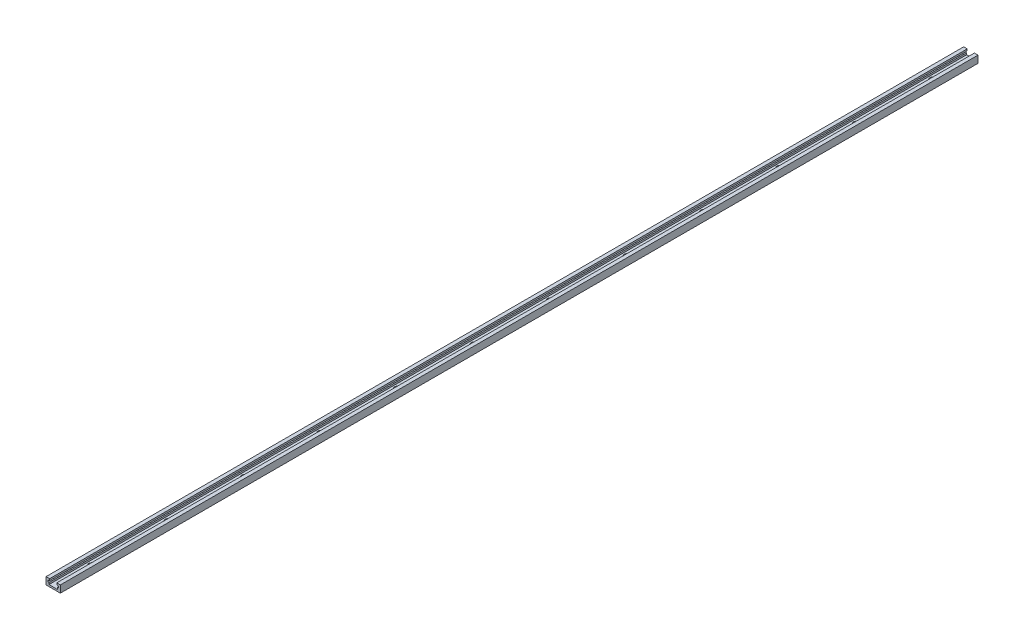
ISO-10303-21;
HEADER;
FILE_DESCRIPTION(('STEP AP214'),'2;1');
FILE_NAME('part.step','',(''),(''),'','','');
FILE_SCHEMA(('AUTOMOTIVE_DESIGN { 1 0 10303 214 1 1 1 1 }'));
ENDSEC;
DATA;
#1=APPLICATION_CONTEXT('core data for automotive mechanical design processes');
#2=APPLICATION_PROTOCOL_DEFINITION('international standard','automotive_design',2000,#1);
#3=PRODUCT_CONTEXT('',#1,'mechanical');
#4=PRODUCT('Part','Part','',(#3));
#5=PRODUCT_RELATED_PRODUCT_CATEGORY('part','',(#4));
#6=PRODUCT_DEFINITION_FORMATION('','',#4);
#7=PRODUCT_DEFINITION_CONTEXT('part definition',#1,'design');
#8=PRODUCT_DEFINITION('design','',#6,#7);
#9=PRODUCT_DEFINITION_SHAPE('','',#8);
#10=(LENGTH_UNIT() NAMED_UNIT(*) SI_UNIT(.MILLI.,.METRE.));
#11=(NAMED_UNIT(*) PLANE_ANGLE_UNIT() SI_UNIT($,.RADIAN.));
#12=(NAMED_UNIT(*) SI_UNIT($,.STERADIAN.) SOLID_ANGLE_UNIT());
#13=UNCERTAINTY_MEASURE_WITH_UNIT(LENGTH_MEASURE(1.E-05),#10,'distance_accuracy_value','');
#14=(GEOMETRIC_REPRESENTATION_CONTEXT(3) GLOBAL_UNCERTAINTY_ASSIGNED_CONTEXT((#13)) GLOBAL_UNIT_ASSIGNED_CONTEXT((#10,
#11,#12)) REPRESENTATION_CONTEXT('',''));
#15=CARTESIAN_POINT('',(0.,0.,0.));
#16=DIRECTION('',(0.,0.,1.));
#17=DIRECTION('',(1.,0.,0.));
#18=AXIS2_PLACEMENT_3D('',#15,#16,#17);
#19=CARTESIAN_POINT('',(-4.7625,0.,609.6));
#20=DIRECTION('',(-1.,0.,0.));
#21=DIRECTION('',(0.,0.,1.));
#22=AXIS2_PLACEMENT_3D('',#19,#20,#21);
#23=PLANE('',#22);
#24=DIRECTION('',(0.,1.,0.));
#25=VECTOR('',#24,1.);
#26=CARTESIAN_POINT('',(-4.7625,0.,-609.6));
#27=LINE('',#26,#25);
#28=CARTESIAN_POINT('',(-4.7625,-2.38125,-609.6));
#29=VERTEX_POINT('',#28);
#30=CARTESIAN_POINT('',(-4.7625,0.,-609.6));
#31=VERTEX_POINT('',#30);
#32=EDGE_CURVE('E180',#29,#31,#27,.T.);
#33=ORIENTED_EDGE('',*,*,#32,.T.);
#34=DIRECTION('',(0.,0.,-1.));
#35=VECTOR('',#34,1.);
#36=CARTESIAN_POINT('',(-4.7625,0.,609.6));
#37=LINE('',#36,#35);
#38=CARTESIAN_POINT('',(-4.7625,0.,609.6));
#39=VERTEX_POINT('',#38);
#40=EDGE_CURVE('E248',#39,#31,#37,.T.);
#41=ORIENTED_EDGE('',*,*,#40,.F.);
#42=DIRECTION('',(0.,1.,0.));
#43=VECTOR('',#42,1.);
#44=CARTESIAN_POINT('',(-4.7625,0.,609.6));
#45=LINE('',#44,#43);
#46=CARTESIAN_POINT('',(-4.7625,-2.38125,609.6));
#47=VERTEX_POINT('',#46);
#48=EDGE_CURVE('E211',#47,#39,#45,.T.);
#49=ORIENTED_EDGE('',*,*,#48,.F.);
#50=DIRECTION('',(0.,0.,-1.));
#51=VECTOR('',#50,1.);
#52=CARTESIAN_POINT('',(-4.7625,-2.38125,609.6));
#53=LINE('',#52,#51);
#54=EDGE_CURVE('E176',#47,#29,#53,.T.);
#55=ORIENTED_EDGE('',*,*,#54,.T.);
#56=EDGE_LOOP('',(#33,#41,#49,#55));
#57=FACE_BOUND('',#56,.T.);
#58=ADVANCED_FACE('F34',(#57),#23,.F.);
#59=CARTESIAN_POINT('',(-4.7625,0.,609.6));
#60=DIRECTION('',(0.,-1.,0.));
#61=DIRECTION('',(1.,0.,0.));
#62=AXIS2_PLACEMENT_3D('',#59,#60,#61);
#63=PLANE('',#62);
#64=DIRECTION('',(-1.,0.,0.));
#65=VECTOR('',#64,1.);
#66=CARTESIAN_POINT('',(-4.7625,0.,-609.6));
#67=LINE('',#66,#65);
#68=CARTESIAN_POINT('',(-9.52500000000001,0.,-609.6));
#69=VERTEX_POINT('',#68);
#70=EDGE_CURVE('E183',#31,#69,#67,.T.);
#71=ORIENTED_EDGE('',*,*,#70,.T.);
#72=DIRECTION('',(0.,0.,-1.));
#73=VECTOR('',#72,1.);
#74=CARTESIAN_POINT('',(-9.52500000000001,0.,609.6));
#75=LINE('',#74,#73);
#76=CARTESIAN_POINT('',(-9.52500000000001,0.,609.6));
#77=VERTEX_POINT('',#76);
#78=EDGE_CURVE('E245',#77,#69,#75,.T.);
#79=ORIENTED_EDGE('',*,*,#78,.F.);
#80=DIRECTION('',(-1.,0.,0.));
#81=VECTOR('',#80,1.);
#82=CARTESIAN_POINT('',(-4.7625,0.,609.6));
#83=LINE('',#82,#81);
#84=EDGE_CURVE('E119',#39,#77,#83,.T.);
#85=ORIENTED_EDGE('',*,*,#84,.F.);
#86=ORIENTED_EDGE('',*,*,#40,.T.);
#87=EDGE_LOOP('',(#71,#79,#85,#86));
#88=FACE_BOUND('',#87,.T.);
#89=ADVANCED_FACE('F366',(#88),#63,.F.);
#90=CARTESIAN_POINT('',(-9.52500000000001,0.,609.6));
#91=DIRECTION('',(1.,0.,0.));
#92=DIRECTION('',(0.,1.,0.));
#93=AXIS2_PLACEMENT_3D('',#90,#91,#92);
#94=PLANE('',#93);
#95=DIRECTION('',(0.,-1.,0.));
#96=VECTOR('',#95,1.);
#97=CARTESIAN_POINT('',(-9.52500000000001,0.,-609.6));
#98=LINE('',#97,#96);
#99=CARTESIAN_POINT('',(-9.52500000000001,-9.525,-609.6));
#100=VERTEX_POINT('',#99);
#101=EDGE_CURVE('E186',#69,#100,#98,.T.);
#102=ORIENTED_EDGE('',*,*,#101,.T.);
#103=DIRECTION('',(0.,0.,-1.));
#104=VECTOR('',#103,1.);
#105=CARTESIAN_POINT('',(-9.52500000000001,-9.525,609.6));
#106=LINE('',#105,#104);
#107=CARTESIAN_POINT('',(-9.52500000000001,-9.525,609.6));
#108=VERTEX_POINT('',#107);
#109=EDGE_CURVE('E242',#108,#100,#106,.T.);
#110=ORIENTED_EDGE('',*,*,#109,.F.);
#111=DIRECTION('',(0.,-1.,0.));
#112=VECTOR('',#111,1.);
#113=CARTESIAN_POINT('',(-9.52500000000001,0.,609.6));
#114=LINE('',#113,#112);
#115=EDGE_CURVE('E718',#77,#108,#114,.T.);
#116=ORIENTED_EDGE('',*,*,#115,.F.);
#117=ORIENTED_EDGE('',*,*,#78,.T.);
#118=EDGE_LOOP('',(#102,#110,#116,#117));
#119=FACE_BOUND('',#118,.T.);
#120=ADVANCED_FACE('F372',(#119),#94,.F.);
#121=CARTESIAN_POINT('',(-9.52500000000001,-9.525,609.6));
#122=DIRECTION('',(0.,1.,0.));
#123=DIRECTION('',(-1.,0.,0.));
#124=AXIS2_PLACEMENT_3D('',#121,#122,#123);
#125=PLANE('',#124);
#126=CARTESIAN_POINT('',(0.,-9.525,-457.2));
#127=DIRECTION('',(0.,1.,0.));
#128=DIRECTION('',(0.,0.,1.));
#129=AXIS2_PLACEMENT_3D('',#126,#127,#128);
#130=CIRCLE('',#129,1.89865);
#131=CARTESIAN_POINT('',(0.,-9.525,-455.30135));
#132=VERTEX_POINT('',#131);
#133=EDGE_CURVE('E733',#132,#132,#130,.T.);
#134=ORIENTED_EDGE('',*,*,#133,.T.);
#135=EDGE_LOOP('',(#134));
#136=FACE_BOUND('',#135,.T.);
#137=CARTESIAN_POINT('',(0.,-9.525,-558.8));
#138=DIRECTION('',(0.,1.,0.));
#139=DIRECTION('',(0.,0.,1.));
#140=AXIS2_PLACEMENT_3D('',#137,#138,#139);
#141=CIRCLE('',#140,1.89865);
#142=CARTESIAN_POINT('',(0.,-9.525,-556.90135));
#143=VERTEX_POINT('',#142);
#144=EDGE_CURVE('E184',#143,#143,#141,.T.);
#145=ORIENTED_EDGE('',*,*,#144,.T.);
#146=EDGE_LOOP('',(#145));
#147=FACE_BOUND('',#146,.T.);
#148=DIRECTION('',(1.,0.,0.));
#149=VECTOR('',#148,1.);
#150=CARTESIAN_POINT('',(-9.52500000000001,-9.525,-609.6));
#151=LINE('',#150,#149);
#152=CARTESIAN_POINT('',(9.52500000000001,-9.52499999999998,-609.6));
#153=VERTEX_POINT('',#152);
#154=EDGE_CURVE('E188',#100,#153,#151,.T.);
#155=ORIENTED_EDGE('',*,*,#154,.T.);
#156=DIRECTION('',(0.,0.,-1.));
#157=VECTOR('',#156,1.);
#158=CARTESIAN_POINT('',(9.52500000000001,-9.52499999999998,609.6));
#159=LINE('',#158,#157);
#160=CARTESIAN_POINT('',(9.52500000000001,-9.52499999999998,609.6));
#161=VERTEX_POINT('',#160);
#162=EDGE_CURVE('E239',#161,#153,#159,.T.);
#163=ORIENTED_EDGE('',*,*,#162,.F.);
#164=DIRECTION('',(1.,0.,0.));
#165=VECTOR('',#164,1.);
#166=CARTESIAN_POINT('',(-9.52500000000001,-9.525,609.6));
#167=LINE('',#166,#165);
#168=EDGE_CURVE('E680',#108,#161,#167,.T.);
#169=ORIENTED_EDGE('',*,*,#168,.F.);
#170=ORIENTED_EDGE('',*,*,#109,.T.);
#171=EDGE_LOOP('',(#155,#163,#169,#170));
#172=FACE_BOUND('',#171,.T.);
#173=CARTESIAN_POINT('',(0.,-9.525,-355.6));
#174=DIRECTION('',(0.,1.,0.));
#175=DIRECTION('',(0.,0.,1.));
#176=AXIS2_PLACEMENT_3D('',#173,#174,#175);
#177=CIRCLE('',#176,1.89865);
#178=CARTESIAN_POINT('',(0.,-9.525,-353.70135));
#179=VERTEX_POINT('',#178);
#180=EDGE_CURVE('E253',#179,#179,#177,.T.);
#181=ORIENTED_EDGE('',*,*,#180,.T.);
#182=EDGE_LOOP('',(#181));
#183=FACE_BOUND('',#182,.T.);
#184=CARTESIAN_POINT('',(0.,-9.525,-254.));
#185=DIRECTION('',(0.,1.,0.));
#186=DIRECTION('',(0.,0.,1.));
#187=AXIS2_PLACEMENT_3D('',#184,#185,#186);
#188=CIRCLE('',#187,1.89865);
#189=CARTESIAN_POINT('',(0.,-9.525,-252.10135));
#190=VERTEX_POINT('',#189);
#191=EDGE_CURVE('E262',#190,#190,#188,.T.);
#192=ORIENTED_EDGE('',*,*,#191,.T.);
#193=EDGE_LOOP('',(#192));
#194=FACE_BOUND('',#193,.T.);
#195=CARTESIAN_POINT('',(0.,-9.525,-152.4));
#196=DIRECTION('',(0.,1.,0.));
#197=DIRECTION('',(0.,0.,1.));
#198=AXIS2_PLACEMENT_3D('',#195,#196,#197);
#199=CIRCLE('',#198,1.89865);
#200=CARTESIAN_POINT('',(0.,-9.525,-150.50135));
#201=VERTEX_POINT('',#200);
#202=EDGE_CURVE('E271',#201,#201,#199,.T.);
#203=ORIENTED_EDGE('',*,*,#202,.T.);
#204=EDGE_LOOP('',(#203));
#205=FACE_BOUND('',#204,.T.);
#206=CARTESIAN_POINT('',(0.,-9.525,-50.8000000000001));
#207=DIRECTION('',(0.,1.,0.));
#208=DIRECTION('',(0.,0.,1.));
#209=AXIS2_PLACEMENT_3D('',#206,#207,#208);
#210=CIRCLE('',#209,1.89865);
#211=CARTESIAN_POINT('',(0.,-9.525,-48.9013500000001));
#212=VERTEX_POINT('',#211);
#213=EDGE_CURVE('E280',#212,#212,#210,.T.);
#214=ORIENTED_EDGE('',*,*,#213,.T.);
#215=EDGE_LOOP('',(#214));
#216=FACE_BOUND('',#215,.T.);
#217=CARTESIAN_POINT('',(0.,-9.525,50.7999999999998));
#218=DIRECTION('',(0.,1.,0.));
#219=DIRECTION('',(0.,0.,1.));
#220=AXIS2_PLACEMENT_3D('',#217,#218,#219);
#221=CIRCLE('',#220,1.89865);
#222=CARTESIAN_POINT('',(0.,-9.525,52.6986499999998));
#223=VERTEX_POINT('',#222);
#224=EDGE_CURVE('E289',#223,#223,#221,.T.);
#225=ORIENTED_EDGE('',*,*,#224,.T.);
#226=EDGE_LOOP('',(#225));
#227=FACE_BOUND('',#226,.T.);
#228=CARTESIAN_POINT('',(0.,-9.525,152.4));
#229=DIRECTION('',(0.,1.,0.));
#230=DIRECTION('',(0.,0.,1.));
#231=AXIS2_PLACEMENT_3D('',#228,#229,#230);
#232=CIRCLE('',#231,1.89865);
#233=CARTESIAN_POINT('',(0.,-9.525,154.29865));
#234=VERTEX_POINT('',#233);
#235=EDGE_CURVE('E298',#234,#234,#232,.T.);
#236=ORIENTED_EDGE('',*,*,#235,.T.);
#237=EDGE_LOOP('',(#236));
#238=FACE_BOUND('',#237,.T.);
#239=CARTESIAN_POINT('',(0.,-9.525,254.));
#240=DIRECTION('',(0.,1.,0.));
#241=DIRECTION('',(0.,0.,1.));
#242=AXIS2_PLACEMENT_3D('',#239,#240,#241);
#243=CIRCLE('',#242,1.89865);
#244=CARTESIAN_POINT('',(0.,-9.525,255.89865));
#245=VERTEX_POINT('',#244);
#246=EDGE_CURVE('E307',#245,#245,#243,.T.);
#247=ORIENTED_EDGE('',*,*,#246,.T.);
#248=EDGE_LOOP('',(#247));
#249=FACE_BOUND('',#248,.T.);
#250=CARTESIAN_POINT('',(0.,-9.525,355.6));
#251=DIRECTION('',(0.,1.,0.));
#252=DIRECTION('',(0.,0.,1.));
#253=AXIS2_PLACEMENT_3D('',#250,#251,#252);
#254=CIRCLE('',#253,1.89865);
#255=CARTESIAN_POINT('',(0.,-9.525,357.49865));
#256=VERTEX_POINT('',#255);
#257=EDGE_CURVE('E316',#256,#256,#254,.T.);
#258=ORIENTED_EDGE('',*,*,#257,.T.);
#259=EDGE_LOOP('',(#258));
#260=FACE_BOUND('',#259,.T.);
#261=CARTESIAN_POINT('',(0.,-9.525,457.2));
#262=DIRECTION('',(0.,1.,0.));
#263=DIRECTION('',(0.,0.,1.));
#264=AXIS2_PLACEMENT_3D('',#261,#262,#263);
#265=CIRCLE('',#264,1.89865);
#266=CARTESIAN_POINT('',(0.,-9.525,459.09865));
#267=VERTEX_POINT('',#266);
#268=EDGE_CURVE('E325',#267,#267,#265,.T.);
#269=ORIENTED_EDGE('',*,*,#268,.T.);
#270=EDGE_LOOP('',(#269));
#271=FACE_BOUND('',#270,.T.);
#272=CARTESIAN_POINT('',(0.,-9.525,558.8));
#273=DIRECTION('',(0.,1.,0.));
#274=DIRECTION('',(0.,0.,1.));
#275=AXIS2_PLACEMENT_3D('',#272,#273,#274);
#276=CIRCLE('',#275,1.89865);
#277=CARTESIAN_POINT('',(0.,-9.525,560.69865));
#278=VERTEX_POINT('',#277);
#279=EDGE_CURVE('E43',#278,#278,#276,.T.);
#280=ORIENTED_EDGE('',*,*,#279,.T.);
#281=EDGE_LOOP('',(#280));
#282=FACE_BOUND('',#281,.T.);
#283=ADVANCED_FACE('F336',(#136,#147,#172,#183,#194,#205,#216,#227,#238,#249,#260,#271,#282),
#125,.F.);
#284=CARTESIAN_POINT('',(9.52500000000001,0.,609.6));
#285=DIRECTION('',(-1.,0.,0.));
#286=DIRECTION('',(0.,-1.,0.));
#287=AXIS2_PLACEMENT_3D('',#284,#285,#286);
#288=PLANE('',#287);
#289=DIRECTION('',(0.,1.,0.));
#290=VECTOR('',#289,1.);
#291=CARTESIAN_POINT('',(9.52500000000001,0.,-609.6));
#292=LINE('',#291,#290);
#293=CARTESIAN_POINT('',(9.52500000000001,0.,-609.6));
#294=VERTEX_POINT('',#293);
#295=EDGE_CURVE('E190',#153,#294,#292,.T.);
#296=ORIENTED_EDGE('',*,*,#295,.T.);
#297=DIRECTION('',(0.,0.,-1.));
#298=VECTOR('',#297,1.);
#299=CARTESIAN_POINT('',(9.52500000000001,0.,609.6));
#300=LINE('',#299,#298);
#301=CARTESIAN_POINT('',(9.52500000000001,0.,609.6));
#302=VERTEX_POINT('',#301);
#303=EDGE_CURVE('E236',#302,#294,#300,.T.);
#304=ORIENTED_EDGE('',*,*,#303,.F.);
#305=DIRECTION('',(0.,1.,0.));
#306=VECTOR('',#305,1.);
#307=CARTESIAN_POINT('',(9.52500000000001,0.,609.6));
#308=LINE('',#307,#306);
#309=EDGE_CURVE('E692',#161,#302,#308,.T.);
#310=ORIENTED_EDGE('',*,*,#309,.F.);
#311=ORIENTED_EDGE('',*,*,#162,.T.);
#312=EDGE_LOOP('',(#296,#304,#310,#311));
#313=FACE_BOUND('',#312,.T.);
#314=ADVANCED_FACE('F643',(#313),#288,.F.);
#315=CARTESIAN_POINT('',(4.7625,0.,609.6));
#316=DIRECTION('',(0.,-1.,0.));
#317=DIRECTION('',(1.,0.,0.));
#318=AXIS2_PLACEMENT_3D('',#315,#316,#317);
#319=PLANE('',#318);
#320=DIRECTION('',(-1.,0.,0.));
#321=VECTOR('',#320,1.);
#322=CARTESIAN_POINT('',(4.7625,0.,-609.6));
#323=LINE('',#322,#321);
#324=CARTESIAN_POINT('',(4.7625,0.,-609.6));
#325=VERTEX_POINT('',#324);
#326=EDGE_CURVE('E192',#294,#325,#323,.T.);
#327=ORIENTED_EDGE('',*,*,#326,.T.);
#328=DIRECTION('',(0.,0.,-1.));
#329=VECTOR('',#328,1.);
#330=CARTESIAN_POINT('',(4.7625,0.,609.6));
#331=LINE('',#330,#329);
#332=CARTESIAN_POINT('',(4.7625,0.,609.6));
#333=VERTEX_POINT('',#332);
#334=EDGE_CURVE('E233',#333,#325,#331,.T.);
#335=ORIENTED_EDGE('',*,*,#334,.F.);
#336=DIRECTION('',(-1.,0.,0.));
#337=VECTOR('',#336,1.);
#338=CARTESIAN_POINT('',(4.7625,0.,609.6));
#339=LINE('',#338,#337);
#340=EDGE_CURVE('E689',#302,#333,#339,.T.);
#341=ORIENTED_EDGE('',*,*,#340,.F.);
#342=ORIENTED_EDGE('',*,*,#303,.T.);
#343=EDGE_LOOP('',(#327,#335,#341,#342));
#344=FACE_BOUND('',#343,.T.);
#345=ADVANCED_FACE('F635',(#344),#319,.F.);
#346=CARTESIAN_POINT('',(4.7625,0.,609.6));
#347=DIRECTION('',(1.,0.,0.));
#348=DIRECTION('',(0.,0.,-1.));
#349=AXIS2_PLACEMENT_3D('',#346,#347,#348);
#350=PLANE('',#349);
#351=DIRECTION('',(0.,-1.,0.));
#352=VECTOR('',#351,1.);
#353=CARTESIAN_POINT('',(4.7625,0.,-609.6));
#354=LINE('',#353,#352);
#355=CARTESIAN_POINT('',(4.7625,-2.38125,-609.6));
#356=VERTEX_POINT('',#355);
#357=EDGE_CURVE('E194',#325,#356,#354,.T.);
#358=ORIENTED_EDGE('',*,*,#357,.T.);
#359=DIRECTION('',(0.,0.,-1.));
#360=VECTOR('',#359,1.);
#361=CARTESIAN_POINT('',(4.7625,-2.38125,609.6));
#362=LINE('',#361,#360);
#363=CARTESIAN_POINT('',(4.7625,-2.38125,609.6));
#364=VERTEX_POINT('',#363);
#365=EDGE_CURVE('E230',#364,#356,#362,.T.);
#366=ORIENTED_EDGE('',*,*,#365,.F.);
#367=DIRECTION('',(0.,-1.,0.));
#368=VECTOR('',#367,1.);
#369=CARTESIAN_POINT('',(4.7625,0.,609.6));
#370=LINE('',#369,#368);
#371=EDGE_CURVE('E691',#333,#364,#370,.T.);
#372=ORIENTED_EDGE('',*,*,#371,.F.);
#373=ORIENTED_EDGE('',*,*,#334,.T.);
#374=EDGE_LOOP('',(#358,#366,#372,#373));
#375=FACE_BOUND('',#374,.T.);
#376=ADVANCED_FACE('F627',(#375),#350,.F.);
#377=CARTESIAN_POINT('',(4.7625,-2.38125,609.6));
#378=DIRECTION('',(0.,1.,0.));
#379=DIRECTION('',(-1.,0.,0.));
#380=AXIS2_PLACEMENT_3D('',#377,#378,#379);
#381=PLANE('',#380);
#382=DIRECTION('',(1.,0.,0.));
#383=VECTOR('',#382,1.);
#384=CARTESIAN_POINT('',(4.7625,-2.38125,-609.6));
#385=LINE('',#384,#383);
#386=CARTESIAN_POINT('',(7.14375,-2.38125,-609.6));
#387=VERTEX_POINT('',#386);
#388=EDGE_CURVE('E196',#356,#387,#385,.T.);
#389=ORIENTED_EDGE('',*,*,#388,.T.);
#390=DIRECTION('',(0.,0.,-1.));
#391=VECTOR('',#390,1.);
#392=CARTESIAN_POINT('',(7.14375,-2.38125,609.6));
#393=LINE('',#392,#391);
#394=CARTESIAN_POINT('',(7.14375,-2.38125,609.6));
#395=VERTEX_POINT('',#394);
#396=EDGE_CURVE('E227',#395,#387,#393,.T.);
#397=ORIENTED_EDGE('',*,*,#396,.F.);
#398=DIRECTION('',(1.,0.,0.));
#399=VECTOR('',#398,1.);
#400=CARTESIAN_POINT('',(4.7625,-2.38125,609.6));
#401=LINE('',#400,#399);
#402=EDGE_CURVE('E694',#364,#395,#401,.T.);
#403=ORIENTED_EDGE('',*,*,#402,.F.);
#404=ORIENTED_EDGE('',*,*,#365,.T.);
#405=EDGE_LOOP('',(#389,#397,#403,#404));
#406=FACE_BOUND('',#405,.T.);
#407=ADVANCED_FACE('F619',(#406),#381,.F.);
#408=CARTESIAN_POINT('',(7.14375,-2.38125,609.6));
#409=DIRECTION('',(1.,0.,0.));
#410=DIRECTION('',(0.,1.,0.));
#411=AXIS2_PLACEMENT_3D('',#408,#409,#410);
#412=PLANE('',#411);
#413=DIRECTION('',(0.,-1.,0.));
#414=VECTOR('',#413,1.);
#415=CARTESIAN_POINT('',(7.14375,-2.38125,-609.6));
#416=LINE('',#415,#414);
#417=CARTESIAN_POINT('',(7.14375,-4.7625,-609.6));
#418=VERTEX_POINT('',#417);
#419=EDGE_CURVE('E198',#387,#418,#416,.T.);
#420=ORIENTED_EDGE('',*,*,#419,.T.);
#421=DIRECTION('',(0.,0.,-1.));
#422=VECTOR('',#421,1.);
#423=CARTESIAN_POINT('',(7.14375,-4.7625,609.6));
#424=LINE('',#423,#422);
#425=CARTESIAN_POINT('',(7.14375,-4.7625,609.6));
#426=VERTEX_POINT('',#425);
#427=EDGE_CURVE('E224',#426,#418,#424,.T.);
#428=ORIENTED_EDGE('',*,*,#427,.F.);
#429=DIRECTION('',(0.,-1.,0.));
#430=VECTOR('',#429,1.);
#431=CARTESIAN_POINT('',(7.14375,-2.38125,609.6));
#432=LINE('',#431,#430);
#433=EDGE_CURVE('E700',#395,#426,#432,.T.);
#434=ORIENTED_EDGE('',*,*,#433,.F.);
#435=ORIENTED_EDGE('',*,*,#396,.T.);
#436=EDGE_LOOP('',(#420,#428,#434,#435));
#437=FACE_BOUND('',#436,.T.);
#438=ADVANCED_FACE('F611',(#437),#412,.F.);
#439=CARTESIAN_POINT('',(7.14375,-4.7625,609.6));
#440=DIRECTION('',(0.,-1.,0.));
#441=DIRECTION('',(1.,0.,0.));
#442=AXIS2_PLACEMENT_3D('',#439,#440,#441);
#443=PLANE('',#442);
#444=DIRECTION('',(-1.,0.,0.));
#445=VECTOR('',#444,1.);
#446=CARTESIAN_POINT('',(7.14375,-4.7625,-609.6));
#447=LINE('',#446,#445);
#448=CARTESIAN_POINT('',(5.55624999999993,-4.7625,-609.6));
#449=VERTEX_POINT('',#448);
#450=EDGE_CURVE('E200',#418,#449,#447,.T.);
#451=ORIENTED_EDGE('',*,*,#450,.T.);
#452=DIRECTION('',(0.,0.,-1.));
#453=VECTOR('',#452,1.);
#454=CARTESIAN_POINT('',(5.55624999999993,-4.7625,609.6));
#455=LINE('',#454,#453);
#456=CARTESIAN_POINT('',(5.55624999999993,-4.7625,609.6));
#457=VERTEX_POINT('',#456);
#458=EDGE_CURVE('E221',#457,#449,#455,.T.);
#459=ORIENTED_EDGE('',*,*,#458,.F.);
#460=DIRECTION('',(-1.,0.,0.));
#461=VECTOR('',#460,1.);
#462=CARTESIAN_POINT('',(7.14375,-4.7625,609.6));
#463=LINE('',#462,#461);
#464=EDGE_CURVE('E702',#426,#457,#463,.T.);
#465=ORIENTED_EDGE('',*,*,#464,.F.);
#466=ORIENTED_EDGE('',*,*,#427,.T.);
#467=EDGE_LOOP('',(#451,#459,#465,#466));
#468=FACE_BOUND('',#467,.T.);
#469=ADVANCED_FACE('F360',(#468),#443,.F.);
#470=CARTESIAN_POINT('',(5.55624999999993,-4.7625,609.6));
#471=DIRECTION('',(1.,0.,0.));
#472=DIRECTION('',(0.,1.,0.));
#473=AXIS2_PLACEMENT_3D('',#470,#471,#472);
#474=PLANE('',#473);
#475=DIRECTION('',(0.,-1.,0.));
#476=VECTOR('',#475,1.);
#477=CARTESIAN_POINT('',(5.55624999999993,-4.7625,-609.6));
#478=LINE('',#477,#476);
#479=CARTESIAN_POINT('',(5.55624999999993,-7.14375,-609.6));
#480=VERTEX_POINT('',#479);
#481=EDGE_CURVE('E202',#449,#480,#478,.T.);
#482=ORIENTED_EDGE('',*,*,#481,.T.);
#483=DIRECTION('',(0.,0.,-1.));
#484=VECTOR('',#483,1.);
#485=CARTESIAN_POINT('',(5.55624999999993,-7.14375,609.6));
#486=LINE('',#485,#484);
#487=CARTESIAN_POINT('',(5.55624999999993,-7.14375,609.6));
#488=VERTEX_POINT('',#487);
#489=EDGE_CURVE('E218',#488,#480,#486,.T.);
#490=ORIENTED_EDGE('',*,*,#489,.F.);
#491=DIRECTION('',(0.,-1.,0.));
#492=VECTOR('',#491,1.);
#493=CARTESIAN_POINT('',(5.55624999999993,-4.7625,609.6));
#494=LINE('',#493,#492);
#495=EDGE_CURVE('E704',#457,#488,#494,.T.);
#496=ORIENTED_EDGE('',*,*,#495,.F.);
#497=ORIENTED_EDGE('',*,*,#458,.T.);
#498=EDGE_LOOP('',(#482,#490,#496,#497));
#499=FACE_BOUND('',#498,.T.);
#500=ADVANCED_FACE('F351',(#499),#474,.F.);
#501=CARTESIAN_POINT('',(5.55624999999993,-7.14375,609.6));
#502=DIRECTION('',(0.,-1.,0.));
#503=DIRECTION('',(1.,0.,0.));
#504=AXIS2_PLACEMENT_3D('',#501,#502,#503);
#505=PLANE('',#504);
#506=CARTESIAN_POINT('',(0.,-7.14375,-457.2));
#507=DIRECTION('',(0.,1.,0.));
#508=DIRECTION('',(0.,0.,1.));
#509=AXIS2_PLACEMENT_3D('',#506,#507,#508);
#510=CIRCLE('',#509,3.5433);
#511=CARTESIAN_POINT('',(0.,-7.14375,-453.6567));
#512=VERTEX_POINT('',#511);
#513=EDGE_CURVE('E736',#512,#512,#510,.T.);
#514=ORIENTED_EDGE('',*,*,#513,.F.);
#515=EDGE_LOOP('',(#514));
#516=FACE_BOUND('',#515,.T.);
#517=CARTESIAN_POINT('',(0.,-7.14375,-558.8));
#518=DIRECTION('',(0.,1.,0.));
#519=DIRECTION('',(0.,0.,1.));
#520=AXIS2_PLACEMENT_3D('',#517,#518,#519);
#521=CIRCLE('',#520,3.5433);
#522=CARTESIAN_POINT('',(0.,-7.14375,-555.2567));
#523=VERTEX_POINT('',#522);
#524=EDGE_CURVE('E727',#523,#523,#521,.T.);
#525=ORIENTED_EDGE('',*,*,#524,.F.);
#526=EDGE_LOOP('',(#525));
#527=FACE_BOUND('',#526,.T.);
#528=DIRECTION('',(-1.,0.,0.));
#529=VECTOR('',#528,1.);
#530=CARTESIAN_POINT('',(5.55624999999993,-7.14375,-609.6));
#531=LINE('',#530,#529);
#532=CARTESIAN_POINT('',(-5.55624999999993,-7.14375,-609.6));
#533=VERTEX_POINT('',#532);
#534=EDGE_CURVE('E204',#480,#533,#531,.T.);
#535=ORIENTED_EDGE('',*,*,#534,.T.);
#536=DIRECTION('',(0.,0.,-1.));
#537=VECTOR('',#536,1.);
#538=CARTESIAN_POINT('',(-5.55624999999993,-7.14375,609.6));
#539=LINE('',#538,#537);
#540=CARTESIAN_POINT('',(-5.55624999999993,-7.14375,609.6));
#541=VERTEX_POINT('',#540);
#542=EDGE_CURVE('E215',#541,#533,#539,.T.);
#543=ORIENTED_EDGE('',*,*,#542,.F.);
#544=DIRECTION('',(-1.,0.,0.));
#545=VECTOR('',#544,1.);
#546=CARTESIAN_POINT('',(5.55624999999993,-7.14375,609.6));
#547=LINE('',#546,#545);
#548=EDGE_CURVE('E706',#488,#541,#547,.T.);
#549=ORIENTED_EDGE('',*,*,#548,.F.);
#550=ORIENTED_EDGE('',*,*,#489,.T.);
#551=EDGE_LOOP('',(#535,#543,#549,#550));
#552=FACE_BOUND('',#551,.T.);
#553=CARTESIAN_POINT('',(0.,-7.14375,-355.6));
#554=DIRECTION('',(0.,1.,0.));
#555=DIRECTION('',(0.,0.,1.));
#556=AXIS2_PLACEMENT_3D('',#553,#554,#555);
#557=CIRCLE('',#556,3.5433);
#558=CARTESIAN_POINT('',(0.,-7.14375,-352.0567));
#559=VERTEX_POINT('',#558);
#560=EDGE_CURVE('E250',#559,#559,#557,.T.);
#561=ORIENTED_EDGE('',*,*,#560,.F.);
#562=EDGE_LOOP('',(#561));
#563=FACE_BOUND('',#562,.T.);
#564=CARTESIAN_POINT('',(0.,-7.14375,-254.));
#565=DIRECTION('',(0.,1.,0.));
#566=DIRECTION('',(0.,0.,1.));
#567=AXIS2_PLACEMENT_3D('',#564,#565,#566);
#568=CIRCLE('',#567,3.5433);
#569=CARTESIAN_POINT('',(0.,-7.14375,-250.4567));
#570=VERTEX_POINT('',#569);
#571=EDGE_CURVE('E259',#570,#570,#568,.T.);
#572=ORIENTED_EDGE('',*,*,#571,.F.);
#573=EDGE_LOOP('',(#572));
#574=FACE_BOUND('',#573,.T.);
#575=CARTESIAN_POINT('',(0.,-7.14375,-152.4));
#576=DIRECTION('',(0.,1.,0.));
#577=DIRECTION('',(0.,0.,1.));
#578=AXIS2_PLACEMENT_3D('',#575,#576,#577);
#579=CIRCLE('',#578,3.5433);
#580=CARTESIAN_POINT('',(0.,-7.14375,-148.8567));
#581=VERTEX_POINT('',#580);
#582=EDGE_CURVE('E268',#581,#581,#579,.T.);
#583=ORIENTED_EDGE('',*,*,#582,.F.);
#584=EDGE_LOOP('',(#583));
#585=FACE_BOUND('',#584,.T.);
#586=CARTESIAN_POINT('',(0.,-7.14375,-50.8000000000001));
#587=DIRECTION('',(0.,1.,0.));
#588=DIRECTION('',(0.,0.,1.));
#589=AXIS2_PLACEMENT_3D('',#586,#587,#588);
#590=CIRCLE('',#589,3.5433);
#591=CARTESIAN_POINT('',(0.,-7.14375,-47.2567000000001));
#592=VERTEX_POINT('',#591);
#593=EDGE_CURVE('E277',#592,#592,#590,.T.);
#594=ORIENTED_EDGE('',*,*,#593,.F.);
#595=EDGE_LOOP('',(#594));
#596=FACE_BOUND('',#595,.T.);
#597=CARTESIAN_POINT('',(0.,-7.14375,50.7999999999998));
#598=DIRECTION('',(0.,1.,0.));
#599=DIRECTION('',(0.,0.,1.));
#600=AXIS2_PLACEMENT_3D('',#597,#598,#599);
#601=CIRCLE('',#600,3.5433);
#602=CARTESIAN_POINT('',(0.,-7.14375,54.3432999999998));
#603=VERTEX_POINT('',#602);
#604=EDGE_CURVE('E286',#603,#603,#601,.T.);
#605=ORIENTED_EDGE('',*,*,#604,.F.);
#606=EDGE_LOOP('',(#605));
#607=FACE_BOUND('',#606,.T.);
#608=CARTESIAN_POINT('',(0.,-7.14375,152.4));
#609=DIRECTION('',(0.,1.,0.));
#610=DIRECTION('',(0.,0.,1.));
#611=AXIS2_PLACEMENT_3D('',#608,#609,#610);
#612=CIRCLE('',#611,3.5433);
#613=CARTESIAN_POINT('',(0.,-7.14375,155.9433));
#614=VERTEX_POINT('',#613);
#615=EDGE_CURVE('E295',#614,#614,#612,.T.);
#616=ORIENTED_EDGE('',*,*,#615,.F.);
#617=EDGE_LOOP('',(#616));
#618=FACE_BOUND('',#617,.T.);
#619=CARTESIAN_POINT('',(0.,-7.14375,254.));
#620=DIRECTION('',(0.,1.,0.));
#621=DIRECTION('',(0.,0.,1.));
#622=AXIS2_PLACEMENT_3D('',#619,#620,#621);
#623=CIRCLE('',#622,3.5433);
#624=CARTESIAN_POINT('',(0.,-7.14375,257.5433));
#625=VERTEX_POINT('',#624);
#626=EDGE_CURVE('E304',#625,#625,#623,.T.);
#627=ORIENTED_EDGE('',*,*,#626,.F.);
#628=EDGE_LOOP('',(#627));
#629=FACE_BOUND('',#628,.T.);
#630=CARTESIAN_POINT('',(0.,-7.14375,355.6));
#631=DIRECTION('',(0.,1.,0.));
#632=DIRECTION('',(0.,0.,1.));
#633=AXIS2_PLACEMENT_3D('',#630,#631,#632);
#634=CIRCLE('',#633,3.5433);
#635=CARTESIAN_POINT('',(0.,-7.14375,359.1433));
#636=VERTEX_POINT('',#635);
#637=EDGE_CURVE('E313',#636,#636,#634,.T.);
#638=ORIENTED_EDGE('',*,*,#637,.F.);
#639=EDGE_LOOP('',(#638));
#640=FACE_BOUND('',#639,.T.);
#641=CARTESIAN_POINT('',(0.,-7.14375,457.2));
#642=DIRECTION('',(0.,1.,0.));
#643=DIRECTION('',(0.,0.,1.));
#644=AXIS2_PLACEMENT_3D('',#641,#642,#643);
#645=CIRCLE('',#644,3.5433);
#646=CARTESIAN_POINT('',(0.,-7.14375,460.7433));
#647=VERTEX_POINT('',#646);
#648=EDGE_CURVE('E322',#647,#647,#645,.T.);
#649=ORIENTED_EDGE('',*,*,#648,.F.);
#650=EDGE_LOOP('',(#649));
#651=FACE_BOUND('',#650,.T.);
#652=CARTESIAN_POINT('',(0.,-7.14375,558.8));
#653=DIRECTION('',(0.,1.,0.));
#654=DIRECTION('',(0.,0.,1.));
#655=AXIS2_PLACEMENT_3D('',#652,#653,#654);
#656=CIRCLE('',#655,3.5433);
#657=CARTESIAN_POINT('',(0.,-7.14375,562.3433));
#658=VERTEX_POINT('',#657);
#659=EDGE_CURVE('E331',#658,#658,#656,.T.);
#660=ORIENTED_EDGE('',*,*,#659,.F.);
#661=EDGE_LOOP('',(#660));
#662=FACE_BOUND('',#661,.T.);
#663=ADVANCED_FACE('F348',(#516,#527,#552,#563,#574,#585,#596,#607,#618,#629,#640,#651,#662),
#505,.F.);
#664=CARTESIAN_POINT('',(-5.55624999999993,-4.7625,609.6));
#665=DIRECTION('',(-1.,0.,0.));
#666=DIRECTION('',(0.,-1.,0.));
#667=AXIS2_PLACEMENT_3D('',#664,#665,#666);
#668=PLANE('',#667);
#669=DIRECTION('',(0.,1.,0.));
#670=VECTOR('',#669,1.);
#671=CARTESIAN_POINT('',(-5.55624999999993,-4.7625,-609.6));
#672=LINE('',#671,#670);
#673=CARTESIAN_POINT('',(-5.55624999999993,-4.7625,-609.6));
#674=VERTEX_POINT('',#673);
#675=EDGE_CURVE('E206',#533,#674,#672,.T.);
#676=ORIENTED_EDGE('',*,*,#675,.T.);
#677=DIRECTION('',(0.,0.,-1.));
#678=VECTOR('',#677,1.);
#679=CARTESIAN_POINT('',(-5.55624999999993,-4.7625,609.6));
#680=LINE('',#679,#678);
#681=CARTESIAN_POINT('',(-5.55624999999993,-4.7625,609.6));
#682=VERTEX_POINT('',#681);
#683=EDGE_CURVE('E171',#682,#674,#680,.T.);
#684=ORIENTED_EDGE('',*,*,#683,.F.);
#685=DIRECTION('',(0.,1.,0.));
#686=VECTOR('',#685,1.);
#687=CARTESIAN_POINT('',(-5.55624999999993,-4.7625,609.6));
#688=LINE('',#687,#686);
#689=EDGE_CURVE('E162',#541,#682,#688,.T.);
#690=ORIENTED_EDGE('',*,*,#689,.F.);
#691=ORIENTED_EDGE('',*,*,#542,.T.);
#692=EDGE_LOOP('',(#676,#684,#690,#691));
#693=FACE_BOUND('',#692,.T.);
#694=ADVANCED_FACE('F350',(#693),#668,.F.);
#695=CARTESIAN_POINT('',(-7.14375,-4.7625,609.6));
#696=DIRECTION('',(0.,-1.,0.));
#697=DIRECTION('',(1.,0.,0.));
#698=AXIS2_PLACEMENT_3D('',#695,#696,#697);
#699=PLANE('',#698);
#700=DIRECTION('',(-1.,0.,0.));
#701=VECTOR('',#700,1.);
#702=CARTESIAN_POINT('',(-7.14375,-4.7625,-609.6));
#703=LINE('',#702,#701);
#704=CARTESIAN_POINT('',(-7.14375,-4.7625,-609.6));
#705=VERTEX_POINT('',#704);
#706=EDGE_CURVE('E170',#674,#705,#703,.T.);
#707=ORIENTED_EDGE('',*,*,#706,.T.);
#708=DIRECTION('',(0.,0.,-1.));
#709=VECTOR('',#708,1.);
#710=CARTESIAN_POINT('',(-7.14375,-4.7625,609.6));
#711=LINE('',#710,#709);
#712=CARTESIAN_POINT('',(-7.14375,-4.7625,609.6));
#713=VERTEX_POINT('',#712);
#714=EDGE_CURVE('E167',#713,#705,#711,.T.);
#715=ORIENTED_EDGE('',*,*,#714,.F.);
#716=DIRECTION('',(-1.,0.,0.));
#717=VECTOR('',#716,1.);
#718=CARTESIAN_POINT('',(-7.14375,-4.7625,609.6));
#719=LINE('',#718,#717);
#720=EDGE_CURVE('E156',#682,#713,#719,.T.);
#721=ORIENTED_EDGE('',*,*,#720,.F.);
#722=ORIENTED_EDGE('',*,*,#683,.T.);
#723=EDGE_LOOP('',(#707,#715,#721,#722));
#724=FACE_BOUND('',#723,.T.);
#725=ADVANCED_FACE('F168',(#724),#699,.F.);
#726=CARTESIAN_POINT('',(-7.14375,-2.38125,609.6));
#727=DIRECTION('',(-1.,0.,0.));
#728=DIRECTION('',(0.,0.,1.));
#729=AXIS2_PLACEMENT_3D('',#726,#727,#728);
#730=PLANE('',#729);
#731=DIRECTION('',(0.,1.,0.));
#732=VECTOR('',#731,1.);
#733=CARTESIAN_POINT('',(-7.14375,-2.38125,-609.6));
#734=LINE('',#733,#732);
#735=CARTESIAN_POINT('',(-7.14375,-2.38125,-609.6));
#736=VERTEX_POINT('',#735);
#737=EDGE_CURVE('E104',#705,#736,#734,.T.);
#738=ORIENTED_EDGE('',*,*,#737,.T.);
#739=DIRECTION('',(0.,0.,-1.));
#740=VECTOR('',#739,1.);
#741=CARTESIAN_POINT('',(-7.14375,-2.38125,609.6));
#742=LINE('',#741,#740);
#743=CARTESIAN_POINT('',(-7.14375,-2.38125,609.6));
#744=VERTEX_POINT('',#743);
#745=EDGE_CURVE('E172',#744,#736,#742,.T.);
#746=ORIENTED_EDGE('',*,*,#745,.F.);
#747=DIRECTION('',(0.,1.,0.));
#748=VECTOR('',#747,1.);
#749=CARTESIAN_POINT('',(-7.14375,-2.38125,609.6));
#750=LINE('',#749,#748);
#751=EDGE_CURVE('E160',#713,#744,#750,.T.);
#752=ORIENTED_EDGE('',*,*,#751,.F.);
#753=ORIENTED_EDGE('',*,*,#714,.T.);
#754=EDGE_LOOP('',(#738,#746,#752,#753));
#755=FACE_BOUND('',#754,.T.);
#756=ADVANCED_FACE('F174',(#755),#730,.F.);
#757=CARTESIAN_POINT('',(-4.7625,-2.38125,609.6));
#758=DIRECTION('',(0.,1.,0.));
#759=DIRECTION('',(-1.,0.,0.));
#760=AXIS2_PLACEMENT_3D('',#757,#758,#759);
#761=PLANE('',#760);
#762=DIRECTION('',(1.,0.,0.));
#763=VECTOR('',#762,1.);
#764=CARTESIAN_POINT('',(-4.7625,-2.38125,-609.6));
#765=LINE('',#764,#763);
#766=EDGE_CURVE('E110',#736,#29,#765,.T.);
#767=ORIENTED_EDGE('',*,*,#766,.T.);
#768=ORIENTED_EDGE('',*,*,#54,.F.);
#769=DIRECTION('',(1.,0.,0.));
#770=VECTOR('',#769,1.);
#771=CARTESIAN_POINT('',(-4.7625,-2.38125,609.6));
#772=LINE('',#771,#770);
#773=EDGE_CURVE('E51',#744,#47,#772,.T.);
#774=ORIENTED_EDGE('',*,*,#773,.F.);
#775=ORIENTED_EDGE('',*,*,#745,.T.);
#776=EDGE_LOOP('',(#767,#768,#774,#775));
#777=FACE_BOUND('',#776,.T.);
#778=ADVANCED_FACE('F575',(#777),#761,.F.);
#779=CARTESIAN_POINT('',(0.,0.,609.6));
#780=DIRECTION('',(0.,0.,-1.));
#781=DIRECTION('',(-1.,0.,0.));
#782=AXIS2_PLACEMENT_3D('',#779,#780,#781);
#783=PLANE('',#782);
#784=ORIENTED_EDGE('',*,*,#48,.T.);
#785=ORIENTED_EDGE('',*,*,#84,.T.);
#786=ORIENTED_EDGE('',*,*,#115,.T.);
#787=ORIENTED_EDGE('',*,*,#168,.T.);
#788=ORIENTED_EDGE('',*,*,#309,.T.);
#789=ORIENTED_EDGE('',*,*,#340,.T.);
#790=ORIENTED_EDGE('',*,*,#371,.T.);
#791=ORIENTED_EDGE('',*,*,#402,.T.);
#792=ORIENTED_EDGE('',*,*,#433,.T.);
#793=ORIENTED_EDGE('',*,*,#464,.T.);
#794=ORIENTED_EDGE('',*,*,#495,.T.);
#795=ORIENTED_EDGE('',*,*,#548,.T.);
#796=ORIENTED_EDGE('',*,*,#689,.T.);
#797=ORIENTED_EDGE('',*,*,#720,.T.);
#798=ORIENTED_EDGE('',*,*,#751,.T.);
#799=ORIENTED_EDGE('',*,*,#773,.T.);
#800=EDGE_LOOP('',(#784,#785,#786,#787,#788,#789,#790,#791,#792,#793,#794,#795,#796,#797,#798,#799));
#801=FACE_BOUND('',#800,.T.);
#802=ADVANCED_FACE('F158',(#801),#783,.F.);
#803=CARTESIAN_POINT('',(0.,0.,-609.6));
#804=DIRECTION('',(0.,0.,-1.));
#805=DIRECTION('',(-1.,0.,0.));
#806=AXIS2_PLACEMENT_3D('',#803,#804,#805);
#807=PLANE('',#806);
#808=ORIENTED_EDGE('',*,*,#32,.F.);
#809=ORIENTED_EDGE('',*,*,#766,.F.);
#810=ORIENTED_EDGE('',*,*,#737,.F.);
#811=ORIENTED_EDGE('',*,*,#706,.F.);
#812=ORIENTED_EDGE('',*,*,#675,.F.);
#813=ORIENTED_EDGE('',*,*,#534,.F.);
#814=ORIENTED_EDGE('',*,*,#481,.F.);
#815=ORIENTED_EDGE('',*,*,#450,.F.);
#816=ORIENTED_EDGE('',*,*,#419,.F.);
#817=ORIENTED_EDGE('',*,*,#388,.F.);
#818=ORIENTED_EDGE('',*,*,#357,.F.);
#819=ORIENTED_EDGE('',*,*,#326,.F.);
#820=ORIENTED_EDGE('',*,*,#295,.F.);
#821=ORIENTED_EDGE('',*,*,#154,.F.);
#822=ORIENTED_EDGE('',*,*,#101,.F.);
#823=ORIENTED_EDGE('',*,*,#70,.F.);
#824=EDGE_LOOP('',(#808,#809,#810,#811,#812,#813,#814,#815,#816,#817,#818,#819,#820,#821,#822,#823));
#825=FACE_BOUND('',#824,.T.);
#826=ADVANCED_FACE('F560',(#825),#807,.T.);
#827=CARTESIAN_POINT('',(0.,-7.14375,-558.8));
#828=DIRECTION('',(0.,1.,0.));
#829=DIRECTION('',(0.,0.,1.));
#830=AXIS2_PLACEMENT_3D('',#827,#828,#829);
#831=CYLINDRICAL_SURFACE('',#830,1.89865);
#832=ORIENTED_EDGE('',*,*,#144,.F.);
#833=EDGE_LOOP('',(#832));
#834=FACE_BOUND('',#833,.T.);
#835=CARTESIAN_POINT('',(0.,-9.03570340093603,-558.8));
#836=DIRECTION('',(0.,1.,0.));
#837=DIRECTION('',(0.,0.,1.));
#838=AXIS2_PLACEMENT_3D('',#835,#836,#837);
#839=CIRCLE('',#838,1.89865);
#840=CARTESIAN_POINT('',(0.,-9.03570340093603,-556.90135));
#841=VERTEX_POINT('',#840);
#842=EDGE_CURVE('E724',#841,#841,#839,.T.);
#843=ORIENTED_EDGE('',*,*,#842,.T.);
#844=EDGE_LOOP('',(#843));
#845=FACE_BOUND('',#844,.T.);
#846=ADVANCED_FACE('F552',(#834,#845),#831,.F.);
#847=CARTESIAN_POINT('',(0.,-7.14375,-558.8));
#848=DIRECTION('',(0.,1.,0.));
#849=DIRECTION('',(0.,0.,1.));
#850=AXIS2_PLACEMENT_3D('',#847,#848,#849);
#851=CONICAL_SURFACE('',#850,3.5433,0.715584993317675);
#852=ORIENTED_EDGE('',*,*,#842,.F.);
#853=EDGE_LOOP('',(#852));
#854=FACE_BOUND('',#853,.T.);
#855=ORIENTED_EDGE('',*,*,#524,.T.);
#856=EDGE_LOOP('',(#855));
#857=FACE_BOUND('',#856,.T.);
#858=ADVANCED_FACE('F544',(#854,#857),#851,.F.);
#859=CARTESIAN_POINT('',(0.,-7.14375,-457.2));
#860=DIRECTION('',(0.,1.,0.));
#861=DIRECTION('',(0.,0.,1.));
#862=AXIS2_PLACEMENT_3D('',#859,#860,#861);
#863=CYLINDRICAL_SURFACE('',#862,1.89865);
#864=ORIENTED_EDGE('',*,*,#133,.F.);
#865=EDGE_LOOP('',(#864));
#866=FACE_BOUND('',#865,.T.);
#867=CARTESIAN_POINT('',(0.,-9.03570340093603,-457.2));
#868=DIRECTION('',(0.,1.,0.));
#869=DIRECTION('',(0.,0.,1.));
#870=AXIS2_PLACEMENT_3D('',#867,#868,#869);
#871=CIRCLE('',#870,1.89865);
#872=CARTESIAN_POINT('',(0.,-9.03570340093603,-455.30135));
#873=VERTEX_POINT('',#872);
#874=EDGE_CURVE('E730',#873,#873,#871,.T.);
#875=ORIENTED_EDGE('',*,*,#874,.T.);
#876=EDGE_LOOP('',(#875));
#877=FACE_BOUND('',#876,.T.);
#878=ADVANCED_FACE('F536',(#866,#877),#863,.F.);
#879=CARTESIAN_POINT('',(0.,-7.14375,-457.2));
#880=DIRECTION('',(0.,1.,0.));
#881=DIRECTION('',(0.,0.,1.));
#882=AXIS2_PLACEMENT_3D('',#879,#880,#881);
#883=CONICAL_SURFACE('',#882,3.5433,0.715584993317675);
#884=ORIENTED_EDGE('',*,*,#874,.F.);
#885=EDGE_LOOP('',(#884));
#886=FACE_BOUND('',#885,.T.);
#887=ORIENTED_EDGE('',*,*,#513,.T.);
#888=EDGE_LOOP('',(#887));
#889=FACE_BOUND('',#888,.T.);
#890=ADVANCED_FACE('F384',(#886,#889),#883,.F.);
#891=CARTESIAN_POINT('',(0.,-7.14375,-355.6));
#892=DIRECTION('',(0.,1.,0.));
#893=DIRECTION('',(0.,0.,1.));
#894=AXIS2_PLACEMENT_3D('',#891,#892,#893);
#895=CONICAL_SURFACE('',#894,3.5433,0.715584993317675);
#896=CARTESIAN_POINT('',(0.,-9.03570340093603,-355.6));
#897=DIRECTION('',(0.,1.,0.));
#898=DIRECTION('',(0.,0.,1.));
#899=AXIS2_PLACEMENT_3D('',#896,#897,#898);
#900=CIRCLE('',#899,1.89865);
#901=CARTESIAN_POINT('',(0.,-9.03570340093603,-353.70135));
#902=VERTEX_POINT('',#901);
#903=EDGE_CURVE('E256',#902,#902,#900,.T.);
#904=ORIENTED_EDGE('',*,*,#903,.F.);
#905=EDGE_LOOP('',(#904));
#906=FACE_BOUND('',#905,.T.);
#907=ORIENTED_EDGE('',*,*,#560,.T.);
#908=EDGE_LOOP('',(#907));
#909=FACE_BOUND('',#908,.T.);
#910=ADVANCED_FACE('F380',(#906,#909),#895,.F.);
#911=CARTESIAN_POINT('',(0.,-7.14375,-355.6));
#912=DIRECTION('',(0.,1.,0.));
#913=DIRECTION('',(0.,0.,1.));
#914=AXIS2_PLACEMENT_3D('',#911,#912,#913);
#915=CYLINDRICAL_SURFACE('',#914,1.89865);
#916=ORIENTED_EDGE('',*,*,#180,.F.);
#917=EDGE_LOOP('',(#916));
#918=FACE_BOUND('',#917,.T.);
#919=ORIENTED_EDGE('',*,*,#903,.T.);
#920=EDGE_LOOP('',(#919));
#921=FACE_BOUND('',#920,.T.);
#922=ADVANCED_FACE('F376',(#918,#921),#915,.F.);
#923=CARTESIAN_POINT('',(0.,-7.14375,-254.));
#924=DIRECTION('',(0.,1.,0.));
#925=DIRECTION('',(0.,0.,1.));
#926=AXIS2_PLACEMENT_3D('',#923,#924,#925);
#927=CONICAL_SURFACE('',#926,3.5433,0.715584993317675);
#928=CARTESIAN_POINT('',(0.,-9.03570340093603,-254.));
#929=DIRECTION('',(0.,1.,0.));
#930=DIRECTION('',(0.,0.,1.));
#931=AXIS2_PLACEMENT_3D('',#928,#929,#930);
#932=CIRCLE('',#931,1.89865);
#933=CARTESIAN_POINT('',(0.,-9.03570340093603,-252.10135));
#934=VERTEX_POINT('',#933);
#935=EDGE_CURVE('E265',#934,#934,#932,.T.);
#936=ORIENTED_EDGE('',*,*,#935,.F.);
#937=EDGE_LOOP('',(#936));
#938=FACE_BOUND('',#937,.T.);
#939=ORIENTED_EDGE('',*,*,#571,.T.);
#940=EDGE_LOOP('',(#939));
#941=FACE_BOUND('',#940,.T.);
#942=ADVANCED_FACE('F379',(#938,#941),#927,.F.);
#943=CARTESIAN_POINT('',(0.,-7.14375,-254.));
#944=DIRECTION('',(0.,1.,0.));
#945=DIRECTION('',(0.,0.,1.));
#946=AXIS2_PLACEMENT_3D('',#943,#944,#945);
#947=CYLINDRICAL_SURFACE('',#946,1.89865);
#948=ORIENTED_EDGE('',*,*,#191,.F.);
#949=EDGE_LOOP('',(#948));
#950=FACE_BOUND('',#949,.T.);
#951=ORIENTED_EDGE('',*,*,#935,.T.);
#952=EDGE_LOOP('',(#951));
#953=FACE_BOUND('',#952,.T.);
#954=ADVANCED_FACE('F386',(#950,#953),#947,.F.);
#955=CARTESIAN_POINT('',(0.,-7.14375,-152.4));
#956=DIRECTION('',(0.,1.,0.));
#957=DIRECTION('',(0.,0.,1.));
#958=AXIS2_PLACEMENT_3D('',#955,#956,#957);
#959=CONICAL_SURFACE('',#958,3.5433,0.715584993317675);
#960=CARTESIAN_POINT('',(0.,-9.03570340093603,-152.4));
#961=DIRECTION('',(0.,1.,0.));
#962=DIRECTION('',(0.,0.,1.));
#963=AXIS2_PLACEMENT_3D('',#960,#961,#962);
#964=CIRCLE('',#963,1.89865);
#965=CARTESIAN_POINT('',(0.,-9.03570340093603,-150.50135));
#966=VERTEX_POINT('',#965);
#967=EDGE_CURVE('E274',#966,#966,#964,.T.);
#968=ORIENTED_EDGE('',*,*,#967,.F.);
#969=EDGE_LOOP('',(#968));
#970=FACE_BOUND('',#969,.T.);
#971=ORIENTED_EDGE('',*,*,#582,.T.);
#972=EDGE_LOOP('',(#971));
#973=FACE_BOUND('',#972,.T.);
#974=ADVANCED_FACE('F389',(#970,#973),#959,.F.);
#975=CARTESIAN_POINT('',(0.,-7.14375,-152.4));
#976=DIRECTION('',(0.,1.,0.));
#977=DIRECTION('',(0.,0.,1.));
#978=AXIS2_PLACEMENT_3D('',#975,#976,#977);
#979=CYLINDRICAL_SURFACE('',#978,1.89865);
#980=ORIENTED_EDGE('',*,*,#202,.F.);
#981=EDGE_LOOP('',(#980));
#982=FACE_BOUND('',#981,.T.);
#983=ORIENTED_EDGE('',*,*,#967,.T.);
#984=EDGE_LOOP('',(#983));
#985=FACE_BOUND('',#984,.T.);
#986=ADVANCED_FACE('F394',(#982,#985),#979,.F.);
#987=CARTESIAN_POINT('',(0.,-7.14375,-50.8000000000001));
#988=DIRECTION('',(0.,1.,0.));
#989=DIRECTION('',(0.,0.,1.));
#990=AXIS2_PLACEMENT_3D('',#987,#988,#989);
#991=CONICAL_SURFACE('',#990,3.5433,0.715584993317675);
#992=CARTESIAN_POINT('',(0.,-9.03570340093603,-50.8000000000001));
#993=DIRECTION('',(0.,1.,0.));
#994=DIRECTION('',(0.,0.,1.));
#995=AXIS2_PLACEMENT_3D('',#992,#993,#994);
#996=CIRCLE('',#995,1.89865);
#997=CARTESIAN_POINT('',(0.,-9.03570340093603,-48.9013500000001));
#998=VERTEX_POINT('',#997);
#999=EDGE_CURVE('E283',#998,#998,#996,.T.);
#1000=ORIENTED_EDGE('',*,*,#999,.F.);
#1001=EDGE_LOOP('',(#1000));
#1002=FACE_BOUND('',#1001,.T.);
#1003=ORIENTED_EDGE('',*,*,#593,.T.);
#1004=EDGE_LOOP('',(#1003));
#1005=FACE_BOUND('',#1004,.T.);
#1006=ADVANCED_FACE('F397',(#1002,#1005),#991,.F.);
#1007=CARTESIAN_POINT('',(0.,-7.14375,-50.8000000000001));
#1008=DIRECTION('',(0.,1.,0.));
#1009=DIRECTION('',(0.,0.,1.));
#1010=AXIS2_PLACEMENT_3D('',#1007,#1008,#1009);
#1011=CYLINDRICAL_SURFACE('',#1010,1.89865);
#1012=ORIENTED_EDGE('',*,*,#213,.F.);
#1013=EDGE_LOOP('',(#1012));
#1014=FACE_BOUND('',#1013,.T.);
#1015=ORIENTED_EDGE('',*,*,#999,.T.);
#1016=EDGE_LOOP('',(#1015));
#1017=FACE_BOUND('',#1016,.T.);
#1018=ADVANCED_FACE('F402',(#1014,#1017),#1011,.F.);
#1019=CARTESIAN_POINT('',(0.,-7.14375,50.7999999999998));
#1020=DIRECTION('',(0.,1.,0.));
#1021=DIRECTION('',(0.,0.,1.));
#1022=AXIS2_PLACEMENT_3D('',#1019,#1020,#1021);
#1023=CONICAL_SURFACE('',#1022,3.5433,0.715584993317675);
#1024=CARTESIAN_POINT('',(0.,-9.03570340093603,50.7999999999998));
#1025=DIRECTION('',(0.,1.,0.));
#1026=DIRECTION('',(0.,0.,1.));
#1027=AXIS2_PLACEMENT_3D('',#1024,#1025,#1026);
#1028=CIRCLE('',#1027,1.89865);
#1029=CARTESIAN_POINT('',(0.,-9.03570340093603,52.6986499999998));
#1030=VERTEX_POINT('',#1029);
#1031=EDGE_CURVE('E292',#1030,#1030,#1028,.T.);
#1032=ORIENTED_EDGE('',*,*,#1031,.F.);
#1033=EDGE_LOOP('',(#1032));
#1034=FACE_BOUND('',#1033,.T.);
#1035=ORIENTED_EDGE('',*,*,#604,.T.);
#1036=EDGE_LOOP('',(#1035));
#1037=FACE_BOUND('',#1036,.T.);
#1038=ADVANCED_FACE('F405',(#1034,#1037),#1023,.F.);
#1039=CARTESIAN_POINT('',(0.,-7.14375,50.7999999999998));
#1040=DIRECTION('',(0.,1.,0.));
#1041=DIRECTION('',(0.,0.,1.));
#1042=AXIS2_PLACEMENT_3D('',#1039,#1040,#1041);
#1043=CYLINDRICAL_SURFACE('',#1042,1.89865);
#1044=ORIENTED_EDGE('',*,*,#224,.F.);
#1045=EDGE_LOOP('',(#1044));
#1046=FACE_BOUND('',#1045,.T.);
#1047=ORIENTED_EDGE('',*,*,#1031,.T.);
#1048=EDGE_LOOP('',(#1047));
#1049=FACE_BOUND('',#1048,.T.);
#1050=ADVANCED_FACE('F410',(#1046,#1049),#1043,.F.);
#1051=CARTESIAN_POINT('',(0.,-7.14375,152.4));
#1052=DIRECTION('',(0.,1.,0.));
#1053=DIRECTION('',(0.,0.,1.));
#1054=AXIS2_PLACEMENT_3D('',#1051,#1052,#1053);
#1055=CONICAL_SURFACE('',#1054,3.5433,0.715584993317675);
#1056=CARTESIAN_POINT('',(0.,-9.03570340093603,152.4));
#1057=DIRECTION('',(0.,1.,0.));
#1058=DIRECTION('',(0.,0.,1.));
#1059=AXIS2_PLACEMENT_3D('',#1056,#1057,#1058);
#1060=CIRCLE('',#1059,1.89865);
#1061=CARTESIAN_POINT('',(0.,-9.03570340093603,154.29865));
#1062=VERTEX_POINT('',#1061);
#1063=EDGE_CURVE('E301',#1062,#1062,#1060,.T.);
#1064=ORIENTED_EDGE('',*,*,#1063,.F.);
#1065=EDGE_LOOP('',(#1064));
#1066=FACE_BOUND('',#1065,.T.);
#1067=ORIENTED_EDGE('',*,*,#615,.T.);
#1068=EDGE_LOOP('',(#1067));
#1069=FACE_BOUND('',#1068,.T.);
#1070=ADVANCED_FACE('F413',(#1066,#1069),#1055,.F.);
#1071=CARTESIAN_POINT('',(0.,-7.14375,152.4));
#1072=DIRECTION('',(0.,1.,0.));
#1073=DIRECTION('',(0.,0.,1.));
#1074=AXIS2_PLACEMENT_3D('',#1071,#1072,#1073);
#1075=CYLINDRICAL_SURFACE('',#1074,1.89865);
#1076=ORIENTED_EDGE('',*,*,#235,.F.);
#1077=EDGE_LOOP('',(#1076));
#1078=FACE_BOUND('',#1077,.T.);
#1079=ORIENTED_EDGE('',*,*,#1063,.T.);
#1080=EDGE_LOOP('',(#1079));
#1081=FACE_BOUND('',#1080,.T.);
#1082=ADVANCED_FACE('F418',(#1078,#1081),#1075,.F.);
#1083=CARTESIAN_POINT('',(0.,-7.14375,254.));
#1084=DIRECTION('',(0.,1.,0.));
#1085=DIRECTION('',(0.,0.,1.));
#1086=AXIS2_PLACEMENT_3D('',#1083,#1084,#1085);
#1087=CONICAL_SURFACE('',#1086,3.5433,0.715584993317675);
#1088=CARTESIAN_POINT('',(0.,-9.03570340093603,254.));
#1089=DIRECTION('',(0.,1.,0.));
#1090=DIRECTION('',(0.,0.,1.));
#1091=AXIS2_PLACEMENT_3D('',#1088,#1089,#1090);
#1092=CIRCLE('',#1091,1.89865);
#1093=CARTESIAN_POINT('',(0.,-9.03570340093603,255.89865));
#1094=VERTEX_POINT('',#1093);
#1095=EDGE_CURVE('E310',#1094,#1094,#1092,.T.);
#1096=ORIENTED_EDGE('',*,*,#1095,.F.);
#1097=EDGE_LOOP('',(#1096));
#1098=FACE_BOUND('',#1097,.T.);
#1099=ORIENTED_EDGE('',*,*,#626,.T.);
#1100=EDGE_LOOP('',(#1099));
#1101=FACE_BOUND('',#1100,.T.);
#1102=ADVANCED_FACE('F421',(#1098,#1101),#1087,.F.);
#1103=CARTESIAN_POINT('',(0.,-7.14375,254.));
#1104=DIRECTION('',(0.,1.,0.));
#1105=DIRECTION('',(0.,0.,1.));
#1106=AXIS2_PLACEMENT_3D('',#1103,#1104,#1105);
#1107=CYLINDRICAL_SURFACE('',#1106,1.89865);
#1108=ORIENTED_EDGE('',*,*,#246,.F.);
#1109=EDGE_LOOP('',(#1108));
#1110=FACE_BOUND('',#1109,.T.);
#1111=ORIENTED_EDGE('',*,*,#1095,.T.);
#1112=EDGE_LOOP('',(#1111));
#1113=FACE_BOUND('',#1112,.T.);
#1114=ADVANCED_FACE('F426',(#1110,#1113),#1107,.F.);
#1115=CARTESIAN_POINT('',(0.,-7.14375,355.6));
#1116=DIRECTION('',(0.,1.,0.));
#1117=DIRECTION('',(0.,0.,1.));
#1118=AXIS2_PLACEMENT_3D('',#1115,#1116,#1117);
#1119=CONICAL_SURFACE('',#1118,3.5433,0.715584993317675);
#1120=CARTESIAN_POINT('',(0.,-9.03570340093603,355.6));
#1121=DIRECTION('',(0.,1.,0.));
#1122=DIRECTION('',(0.,0.,1.));
#1123=AXIS2_PLACEMENT_3D('',#1120,#1121,#1122);
#1124=CIRCLE('',#1123,1.89865);
#1125=CARTESIAN_POINT('',(0.,-9.03570340093603,357.49865));
#1126=VERTEX_POINT('',#1125);
#1127=EDGE_CURVE('E319',#1126,#1126,#1124,.T.);
#1128=ORIENTED_EDGE('',*,*,#1127,.F.);
#1129=EDGE_LOOP('',(#1128));
#1130=FACE_BOUND('',#1129,.T.);
#1131=ORIENTED_EDGE('',*,*,#637,.T.);
#1132=EDGE_LOOP('',(#1131));
#1133=FACE_BOUND('',#1132,.T.);
#1134=ADVANCED_FACE('F429',(#1130,#1133),#1119,.F.);
#1135=CARTESIAN_POINT('',(0.,-7.14375,355.6));
#1136=DIRECTION('',(0.,1.,0.));
#1137=DIRECTION('',(0.,0.,1.));
#1138=AXIS2_PLACEMENT_3D('',#1135,#1136,#1137);
#1139=CYLINDRICAL_SURFACE('',#1138,1.89865);
#1140=ORIENTED_EDGE('',*,*,#257,.F.);
#1141=EDGE_LOOP('',(#1140));
#1142=FACE_BOUND('',#1141,.T.);
#1143=ORIENTED_EDGE('',*,*,#1127,.T.);
#1144=EDGE_LOOP('',(#1143));
#1145=FACE_BOUND('',#1144,.T.);
#1146=ADVANCED_FACE('F434',(#1142,#1145),#1139,.F.);
#1147=CARTESIAN_POINT('',(0.,-7.14375,457.2));
#1148=DIRECTION('',(0.,1.,0.));
#1149=DIRECTION('',(0.,0.,1.));
#1150=AXIS2_PLACEMENT_3D('',#1147,#1148,#1149);
#1151=CONICAL_SURFACE('',#1150,3.5433,0.715584993317675);
#1152=CARTESIAN_POINT('',(0.,-9.03570340093603,457.2));
#1153=DIRECTION('',(0.,1.,0.));
#1154=DIRECTION('',(0.,0.,1.));
#1155=AXIS2_PLACEMENT_3D('',#1152,#1153,#1154);
#1156=CIRCLE('',#1155,1.89865);
#1157=CARTESIAN_POINT('',(0.,-9.03570340093603,459.09865));
#1158=VERTEX_POINT('',#1157);
#1159=EDGE_CURVE('E328',#1158,#1158,#1156,.T.);
#1160=ORIENTED_EDGE('',*,*,#1159,.F.);
#1161=EDGE_LOOP('',(#1160));
#1162=FACE_BOUND('',#1161,.T.);
#1163=ORIENTED_EDGE('',*,*,#648,.T.);
#1164=EDGE_LOOP('',(#1163));
#1165=FACE_BOUND('',#1164,.T.);
#1166=ADVANCED_FACE('F437',(#1162,#1165),#1151,.F.);
#1167=CARTESIAN_POINT('',(0.,-7.14375,457.2));
#1168=DIRECTION('',(0.,1.,0.));
#1169=DIRECTION('',(0.,0.,1.));
#1170=AXIS2_PLACEMENT_3D('',#1167,#1168,#1169);
#1171=CYLINDRICAL_SURFACE('',#1170,1.89865);
#1172=ORIENTED_EDGE('',*,*,#268,.F.);
#1173=EDGE_LOOP('',(#1172));
#1174=FACE_BOUND('',#1173,.T.);
#1175=ORIENTED_EDGE('',*,*,#1159,.T.);
#1176=EDGE_LOOP('',(#1175));
#1177=FACE_BOUND('',#1176,.T.);
#1178=ADVANCED_FACE('F345',(#1174,#1177),#1171,.F.);
#1179=CARTESIAN_POINT('',(0.,-7.14375,558.8));
#1180=DIRECTION('',(0.,1.,0.));
#1181=DIRECTION('',(0.,0.,1.));
#1182=AXIS2_PLACEMENT_3D('',#1179,#1180,#1181);
#1183=CONICAL_SURFACE('',#1182,3.5433,0.715584993317675);
#1184=CARTESIAN_POINT('',(0.,-9.03570340093603,558.8));
#1185=DIRECTION('',(0.,1.,0.));
#1186=DIRECTION('',(0.,0.,1.));
#1187=AXIS2_PLACEMENT_3D('',#1184,#1185,#1186);
#1188=CIRCLE('',#1187,1.89865);
#1189=CARTESIAN_POINT('',(0.,-9.03570340093603,560.69865));
#1190=VERTEX_POINT('',#1189);
#1191=EDGE_CURVE('E11',#1190,#1190,#1188,.T.);
#1192=ORIENTED_EDGE('',*,*,#1191,.F.);
#1193=EDGE_LOOP('',(#1192));
#1194=FACE_BOUND('',#1193,.T.);
#1195=ORIENTED_EDGE('',*,*,#659,.T.);
#1196=EDGE_LOOP('',(#1195));
#1197=FACE_BOUND('',#1196,.T.);
#1198=ADVANCED_FACE('F36',(#1194,#1197),#1183,.F.);
#1199=CARTESIAN_POINT('',(0.,-7.14375,558.8));
#1200=DIRECTION('',(0.,1.,0.));
#1201=DIRECTION('',(0.,0.,1.));
#1202=AXIS2_PLACEMENT_3D('',#1199,#1200,#1201);
#1203=CYLINDRICAL_SURFACE('',#1202,1.89865);
#1204=ORIENTED_EDGE('',*,*,#279,.F.);
#1205=EDGE_LOOP('',(#1204));
#1206=FACE_BOUND('',#1205,.T.);
#1207=ORIENTED_EDGE('',*,*,#1191,.T.);
#1208=EDGE_LOOP('',(#1207));
#1209=FACE_BOUND('',#1208,.T.);
#1210=ADVANCED_FACE('F338',(#1206,#1209),#1203,.F.);
#1211=CLOSED_SHELL('',(#58,#89,#120,#283,#314,#345,#376,#407,#438,#469,#500,#663,#694,#725,#756,
#778,#802,#826,#846,#858,#878,#890,#910,#922,#942,#954,#974,#986,#1006,#1018,#1038,#1050,#1070,
#1082,#1102,#1114,#1134,#1146,#1166,#1178,#1198,#1210));
#1212=MANIFOLD_SOLID_BREP('B2',#1211);
#1213=ADVANCED_BREP_SHAPE_REPRESENTATION('',(#18,#1212),#14);
#1214=SHAPE_DEFINITION_REPRESENTATION(#9,#1213);
ENDSEC;
END-ISO-10303-21;
